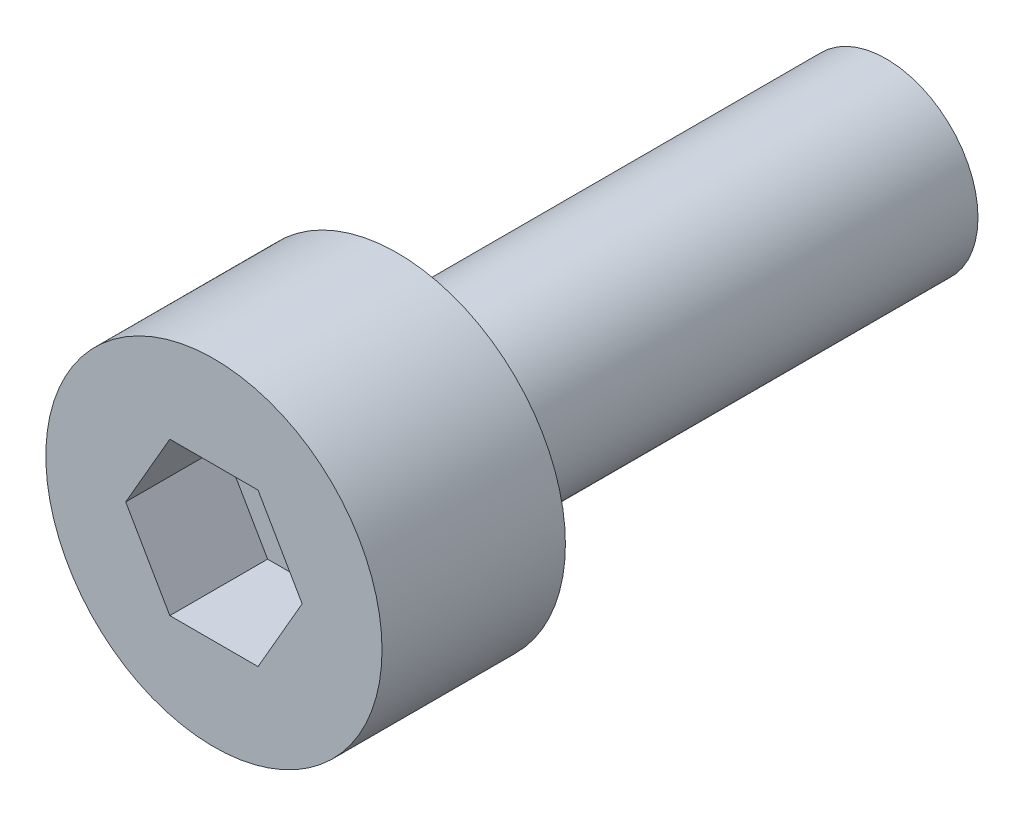
ISO-10303-21;
HEADER;
FILE_DESCRIPTION(('STEP AP214'),'2;1');
FILE_NAME('part.step','',(''),(''),'','','');
FILE_SCHEMA(('AUTOMOTIVE_DESIGN { 1 0 10303 214 1 1 1 1 }'));
ENDSEC;
DATA;
#1=APPLICATION_CONTEXT('core data for automotive mechanical design processes');
#2=APPLICATION_PROTOCOL_DEFINITION('international standard','automotive_design',2000,#1);
#3=PRODUCT_CONTEXT('',#1,'mechanical');
#4=PRODUCT('Part','Part','',(#3));
#5=PRODUCT_RELATED_PRODUCT_CATEGORY('part','',(#4));
#6=PRODUCT_DEFINITION_FORMATION('','',#4);
#7=PRODUCT_DEFINITION_CONTEXT('part definition',#1,'design');
#8=PRODUCT_DEFINITION('design','',#6,#7);
#9=PRODUCT_DEFINITION_SHAPE('','',#8);
#10=(LENGTH_UNIT() NAMED_UNIT(*) SI_UNIT(.MILLI.,.METRE.));
#11=(NAMED_UNIT(*) PLANE_ANGLE_UNIT() SI_UNIT($,.RADIAN.));
#12=(NAMED_UNIT(*) SI_UNIT($,.STERADIAN.) SOLID_ANGLE_UNIT());
#13=UNCERTAINTY_MEASURE_WITH_UNIT(LENGTH_MEASURE(1.E-05),#10,'distance_accuracy_value','');
#14=(GEOMETRIC_REPRESENTATION_CONTEXT(3) GLOBAL_UNCERTAINTY_ASSIGNED_CONTEXT((#13)) GLOBAL_UNIT_ASSIGNED_CONTEXT((#10,
#11,#12)) REPRESENTATION_CONTEXT('',''));
#15=CARTESIAN_POINT('',(0.,0.,0.));
#16=DIRECTION('',(0.,0.,1.));
#17=DIRECTION('',(1.,0.,0.));
#18=AXIS2_PLACEMENT_3D('',#15,#16,#17);
#19=CARTESIAN_POINT('',(0.,0.,11.));
#20=DIRECTION('',(0.,0.,1.));
#21=DIRECTION('',(1.,0.,0.));
#22=AXIS2_PLACEMENT_3D('',#19,#20,#21);
#23=PLANE('',#22);
#24=CARTESIAN_POINT('',(0.,0.,11.));
#25=DIRECTION('',(0.,0.,1.));
#26=DIRECTION('',(1.,0.,0.));
#27=AXIS2_PLACEMENT_3D('',#24,#25,#26);
#28=CIRCLE('',#27,2.75);
#29=CARTESIAN_POINT('',(2.75,0.,11.));
#30=VERTEX_POINT('',#29);
#31=EDGE_CURVE('E148',#30,#30,#28,.T.);
#32=ORIENTED_EDGE('',*,*,#31,.T.);
#33=EDGE_LOOP('',(#32));
#34=FACE_BOUND('',#33,.T.);
#35=DIRECTION('',(-0.5,0.866025403784439,0.));
#36=VECTOR('',#35,1.);
#37=CARTESIAN_POINT('',(1.44337567297406,0.,11.));
#38=LINE('',#37,#36);
#39=CARTESIAN_POINT('',(1.44337567297406,0.,11.));
#40=VERTEX_POINT('',#39);
#41=CARTESIAN_POINT('',(0.721687836487032,1.25,11.));
#42=VERTEX_POINT('',#41);
#43=EDGE_CURVE('E114',#40,#42,#38,.T.);
#44=ORIENTED_EDGE('',*,*,#43,.F.);
#45=DIRECTION('',(0.5,0.866025403784438,0.));
#46=VECTOR('',#45,1.);
#47=CARTESIAN_POINT('',(0.721687836487031,-1.25,11.));
#48=LINE('',#47,#46);
#49=CARTESIAN_POINT('',(0.721687836487031,-1.25,11.));
#50=VERTEX_POINT('',#49);
#51=EDGE_CURVE('E93',#50,#40,#48,.T.);
#52=ORIENTED_EDGE('',*,*,#51,.F.);
#53=DIRECTION('',(1.,0.,0.));
#54=VECTOR('',#53,1.);
#55=CARTESIAN_POINT('',(-0.721687836487033,-1.25,11.));
#56=LINE('',#55,#54);
#57=CARTESIAN_POINT('',(-0.721687836487033,-1.25,11.));
#58=VERTEX_POINT('',#57);
#59=EDGE_CURVE('E60',#58,#50,#56,.T.);
#60=ORIENTED_EDGE('',*,*,#59,.F.);
#61=DIRECTION('',(0.5,-0.866025403784439,0.));
#62=VECTOR('',#61,1.);
#63=CARTESIAN_POINT('',(-1.44337567297406,0.,11.));
#64=LINE('',#63,#62);
#65=CARTESIAN_POINT('',(-1.44337567297406,0.,11.));
#66=VERTEX_POINT('',#65);
#67=EDGE_CURVE('E124',#66,#58,#64,.T.);
#68=ORIENTED_EDGE('',*,*,#67,.F.);
#69=DIRECTION('',(-0.5,-0.866025403784439,0.));
#70=VECTOR('',#69,1.);
#71=CARTESIAN_POINT('',(-0.721687836487032,1.25,11.));
#72=LINE('',#71,#70);
#73=CARTESIAN_POINT('',(-0.721687836487032,1.25,11.));
#74=VERTEX_POINT('',#73);
#75=EDGE_CURVE('E113',#74,#66,#72,.T.);
#76=ORIENTED_EDGE('',*,*,#75,.F.);
#77=DIRECTION('',(-1.,0.,0.));
#78=VECTOR('',#77,1.);
#79=CARTESIAN_POINT('',(0.721687836487032,1.25,11.));
#80=LINE('',#79,#78);
#81=EDGE_CURVE('E102',#42,#74,#80,.T.);
#82=ORIENTED_EDGE('',*,*,#81,.F.);
#83=EDGE_LOOP('',(#44,#52,#60,#68,#76,#82));
#84=FACE_BOUND('',#83,.T.);
#85=ADVANCED_FACE('F39',(#34,#84),#23,.T.);
#86=CARTESIAN_POINT('',(0.,0.,8.));
#87=DIRECTION('',(0.,0.,-1.));
#88=DIRECTION('',(-1.,0.,0.));
#89=AXIS2_PLACEMENT_3D('',#86,#87,#88);
#90=CYLINDRICAL_SURFACE('',#89,1.5);
#91=CARTESIAN_POINT('',(0.,0.,8.));
#92=DIRECTION('',(0.,0.,1.));
#93=DIRECTION('',(1.,0.,0.));
#94=AXIS2_PLACEMENT_3D('',#91,#92,#93);
#95=CIRCLE('',#94,1.5);
#96=CARTESIAN_POINT('',(1.5,0.,8.));
#97=VERTEX_POINT('',#96);
#98=EDGE_CURVE('E11',#97,#97,#95,.T.);
#99=ORIENTED_EDGE('',*,*,#98,.F.);
#100=EDGE_LOOP('',(#99));
#101=FACE_BOUND('',#100,.T.);
#102=CARTESIAN_POINT('',(0.,0.,0.));
#103=DIRECTION('',(0.,0.,1.));
#104=DIRECTION('',(1.,0.,0.));
#105=AXIS2_PLACEMENT_3D('',#102,#103,#104);
#106=CIRCLE('',#105,1.5);
#107=CARTESIAN_POINT('',(1.5,0.,0.));
#108=VERTEX_POINT('',#107);
#109=EDGE_CURVE('E43',#108,#108,#106,.T.);
#110=ORIENTED_EDGE('',*,*,#109,.T.);
#111=EDGE_LOOP('',(#110));
#112=FACE_BOUND('',#111,.T.);
#113=ADVANCED_FACE('F41',(#101,#112),#90,.T.);
#114=CARTESIAN_POINT('',(0.,0.,0.));
#115=DIRECTION('',(0.,0.,1.));
#116=DIRECTION('',(1.,0.,0.));
#117=AXIS2_PLACEMENT_3D('',#114,#115,#116);
#118=PLANE('',#117);
#119=ORIENTED_EDGE('',*,*,#109,.F.);
#120=EDGE_LOOP('',(#119));
#121=FACE_BOUND('',#120,.T.);
#122=ADVANCED_FACE('F168',(#121),#118,.F.);
#123=CARTESIAN_POINT('',(0.,0.,11.));
#124=DIRECTION('',(0.,0.,-1.));
#125=DIRECTION('',(-1.,0.,0.));
#126=AXIS2_PLACEMENT_3D('',#123,#124,#125);
#127=CYLINDRICAL_SURFACE('',#126,2.75);
#128=ORIENTED_EDGE('',*,*,#31,.F.);
#129=EDGE_LOOP('',(#128));
#130=FACE_BOUND('',#129,.T.);
#131=CARTESIAN_POINT('',(0.,0.,8.));
#132=DIRECTION('',(0.,0.,1.));
#133=DIRECTION('',(1.,0.,0.));
#134=AXIS2_PLACEMENT_3D('',#131,#132,#133);
#135=CIRCLE('',#134,2.75);
#136=CARTESIAN_POINT('',(2.75,0.,8.));
#137=VERTEX_POINT('',#136);
#138=EDGE_CURVE('E147',#137,#137,#135,.T.);
#139=ORIENTED_EDGE('',*,*,#138,.T.);
#140=EDGE_LOOP('',(#139));
#141=FACE_BOUND('',#140,.T.);
#142=ADVANCED_FACE('F154',(#130,#141),#127,.T.);
#143=CARTESIAN_POINT('',(0.,0.,8.));
#144=DIRECTION('',(0.,0.,1.));
#145=DIRECTION('',(1.,0.,0.));
#146=AXIS2_PLACEMENT_3D('',#143,#144,#145);
#147=PLANE('',#146);
#148=ORIENTED_EDGE('',*,*,#98,.T.);
#149=EDGE_LOOP('',(#148));
#150=FACE_BOUND('',#149,.T.);
#151=ORIENTED_EDGE('',*,*,#138,.F.);
#152=EDGE_LOOP('',(#151));
#153=FACE_BOUND('',#152,.T.);
#154=ADVANCED_FACE('F156',(#150,#153),#147,.F.);
#155=CARTESIAN_POINT('',(0.721687836487031,-1.25,11.));
#156=DIRECTION('',(-0.866025403784438,0.5,0.));
#157=DIRECTION('',(-0.5,-0.866025403784439,0.));
#158=AXIS2_PLACEMENT_3D('',#155,#156,#157);
#159=PLANE('',#158);
#160=DIRECTION('',(0.5,0.866025403784438,0.));
#161=VECTOR('',#160,1.);
#162=CARTESIAN_POINT('',(0.721687836487031,-1.25,9.4));
#163=LINE('',#162,#161);
#164=CARTESIAN_POINT('',(0.721687836487031,-1.25,9.4));
#165=VERTEX_POINT('',#164);
#166=CARTESIAN_POINT('',(1.44337567297406,0.,9.4));
#167=VERTEX_POINT('',#166);
#168=EDGE_CURVE('E131',#165,#167,#163,.T.);
#169=ORIENTED_EDGE('',*,*,#168,.F.);
#170=DIRECTION('',(0.,0.,-1.));
#171=VECTOR('',#170,1.);
#172=CARTESIAN_POINT('',(0.721687836487031,-1.25,11.));
#173=LINE('',#172,#171);
#174=EDGE_CURVE('E130',#50,#165,#173,.T.);
#175=ORIENTED_EDGE('',*,*,#174,.F.);
#176=ORIENTED_EDGE('',*,*,#51,.T.);
#177=DIRECTION('',(0.,0.,-1.));
#178=VECTOR('',#177,1.);
#179=CARTESIAN_POINT('',(1.44337567297406,0.,11.));
#180=LINE('',#179,#178);
#181=EDGE_CURVE('E145',#40,#167,#180,.T.);
#182=ORIENTED_EDGE('',*,*,#181,.T.);
#183=EDGE_LOOP('',(#169,#175,#176,#182));
#184=FACE_BOUND('',#183,.T.);
#185=ADVANCED_FACE('F158',(#184),#159,.T.);
#186=CARTESIAN_POINT('',(1.44337567297406,0.,11.));
#187=DIRECTION('',(-0.866025403784439,-0.5,0.));
#188=DIRECTION('',(0.5,-0.866025403784439,0.));
#189=AXIS2_PLACEMENT_3D('',#186,#187,#188);
#190=PLANE('',#189);
#191=DIRECTION('',(-0.5,0.866025403784439,0.));
#192=VECTOR('',#191,1.);
#193=CARTESIAN_POINT('',(1.44337567297406,0.,9.4));
#194=LINE('',#193,#192);
#195=CARTESIAN_POINT('',(0.721687836487032,1.25,9.4));
#196=VERTEX_POINT('',#195);
#197=EDGE_CURVE('E133',#167,#196,#194,.T.);
#198=ORIENTED_EDGE('',*,*,#197,.F.);
#199=ORIENTED_EDGE('',*,*,#181,.F.);
#200=ORIENTED_EDGE('',*,*,#43,.T.);
#201=DIRECTION('',(0.,0.,-1.));
#202=VECTOR('',#201,1.);
#203=CARTESIAN_POINT('',(0.721687836487032,1.25,11.));
#204=LINE('',#203,#202);
#205=EDGE_CURVE('E109',#42,#196,#204,.T.);
#206=ORIENTED_EDGE('',*,*,#205,.T.);
#207=EDGE_LOOP('',(#198,#199,#200,#206));
#208=FACE_BOUND('',#207,.T.);
#209=ADVANCED_FACE('F166',(#208),#190,.T.);
#210=CARTESIAN_POINT('',(0.721687836487032,1.25,11.));
#211=DIRECTION('',(0.,-1.,0.));
#212=DIRECTION('',(1.,0.,0.));
#213=AXIS2_PLACEMENT_3D('',#210,#211,#212);
#214=PLANE('',#213);
#215=DIRECTION('',(-1.,0.,0.));
#216=VECTOR('',#215,1.);
#217=CARTESIAN_POINT('',(0.721687836487032,1.25,9.4));
#218=LINE('',#217,#216);
#219=CARTESIAN_POINT('',(-0.721687836487032,1.25,9.4));
#220=VERTEX_POINT('',#219);
#221=EDGE_CURVE('E135',#196,#220,#218,.T.);
#222=ORIENTED_EDGE('',*,*,#221,.F.);
#223=ORIENTED_EDGE('',*,*,#205,.F.);
#224=ORIENTED_EDGE('',*,*,#81,.T.);
#225=DIRECTION('',(0.,0.,-1.));
#226=VECTOR('',#225,1.);
#227=CARTESIAN_POINT('',(-0.721687836487032,1.25,11.));
#228=LINE('',#227,#226);
#229=EDGE_CURVE('E106',#74,#220,#228,.T.);
#230=ORIENTED_EDGE('',*,*,#229,.T.);
#231=EDGE_LOOP('',(#222,#223,#224,#230));
#232=FACE_BOUND('',#231,.T.);
#233=ADVANCED_FACE('F105',(#232),#214,.T.);
#234=CARTESIAN_POINT('',(-0.721687836487032,1.25,11.));
#235=DIRECTION('',(0.866025403784439,-0.5,0.));
#236=DIRECTION('',(0.5,0.866025403784439,0.));
#237=AXIS2_PLACEMENT_3D('',#234,#235,#236);
#238=PLANE('',#237);
#239=DIRECTION('',(-0.5,-0.866025403784439,0.));
#240=VECTOR('',#239,1.);
#241=CARTESIAN_POINT('',(-0.721687836487032,1.25,9.4));
#242=LINE('',#241,#240);
#243=CARTESIAN_POINT('',(-1.44337567297406,0.,9.4));
#244=VERTEX_POINT('',#243);
#245=EDGE_CURVE('E120',#220,#244,#242,.T.);
#246=ORIENTED_EDGE('',*,*,#245,.F.);
#247=ORIENTED_EDGE('',*,*,#229,.F.);
#248=ORIENTED_EDGE('',*,*,#75,.T.);
#249=DIRECTION('',(0.,0.,-1.));
#250=VECTOR('',#249,1.);
#251=CARTESIAN_POINT('',(-1.44337567297406,0.,11.));
#252=LINE('',#251,#250);
#253=EDGE_CURVE('E121',#66,#244,#252,.T.);
#254=ORIENTED_EDGE('',*,*,#253,.T.);
#255=EDGE_LOOP('',(#246,#247,#248,#254));
#256=FACE_BOUND('',#255,.T.);
#257=ADVANCED_FACE('F117',(#256),#238,.T.);
#258=CARTESIAN_POINT('',(-1.44337567297406,0.,11.));
#259=DIRECTION('',(0.866025403784439,0.5,0.));
#260=DIRECTION('',(-0.5,0.866025403784439,0.));
#261=AXIS2_PLACEMENT_3D('',#258,#259,#260);
#262=PLANE('',#261);
#263=DIRECTION('',(0.5,-0.866025403784439,0.));
#264=VECTOR('',#263,1.);
#265=CARTESIAN_POINT('',(-1.44337567297406,0.,9.4));
#266=LINE('',#265,#264);
#267=CARTESIAN_POINT('',(-0.721687836487033,-1.25,9.4));
#268=VERTEX_POINT('',#267);
#269=EDGE_CURVE('E138',#244,#268,#266,.T.);
#270=ORIENTED_EDGE('',*,*,#269,.F.);
#271=ORIENTED_EDGE('',*,*,#253,.F.);
#272=ORIENTED_EDGE('',*,*,#67,.T.);
#273=DIRECTION('',(0.,0.,-1.));
#274=VECTOR('',#273,1.);
#275=CARTESIAN_POINT('',(-0.721687836487033,-1.25,11.));
#276=LINE('',#275,#274);
#277=EDGE_CURVE('E54',#58,#268,#276,.T.);
#278=ORIENTED_EDGE('',*,*,#277,.T.);
#279=EDGE_LOOP('',(#270,#271,#272,#278));
#280=FACE_BOUND('',#279,.T.);
#281=ADVANCED_FACE('F185',(#280),#262,.T.);
#282=CARTESIAN_POINT('',(-0.721687836487033,-1.25,11.));
#283=DIRECTION('',(0.,1.,0.));
#284=DIRECTION('',(-1.,0.,0.));
#285=AXIS2_PLACEMENT_3D('',#282,#283,#284);
#286=PLANE('',#285);
#287=DIRECTION('',(1.,0.,0.));
#288=VECTOR('',#287,1.);
#289=CARTESIAN_POINT('',(-0.721687836487033,-1.25,9.4));
#290=LINE('',#289,#288);
#291=EDGE_CURVE('E86',#268,#165,#290,.T.);
#292=ORIENTED_EDGE('',*,*,#291,.F.);
#293=ORIENTED_EDGE('',*,*,#277,.F.);
#294=ORIENTED_EDGE('',*,*,#59,.T.);
#295=ORIENTED_EDGE('',*,*,#174,.T.);
#296=EDGE_LOOP('',(#292,#293,#294,#295));
#297=FACE_BOUND('',#296,.T.);
#298=ADVANCED_FACE('F188',(#297),#286,.T.);
#299=CARTESIAN_POINT('',(0.,0.,9.4));
#300=DIRECTION('',(0.,0.,1.));
#301=DIRECTION('',(1.,0.,0.));
#302=AXIS2_PLACEMENT_3D('',#299,#300,#301);
#303=PLANE('',#302);
#304=ORIENTED_EDGE('',*,*,#168,.T.);
#305=ORIENTED_EDGE('',*,*,#197,.T.);
#306=ORIENTED_EDGE('',*,*,#221,.T.);
#307=ORIENTED_EDGE('',*,*,#245,.T.);
#308=ORIENTED_EDGE('',*,*,#269,.T.);
#309=ORIENTED_EDGE('',*,*,#291,.T.);
#310=EDGE_LOOP('',(#304,#305,#306,#307,#308,#309));
#311=FACE_BOUND('',#310,.T.);
#312=ADVANCED_FACE('F192',(#311),#303,.T.);
#313=CLOSED_SHELL('',(#85,#113,#122,#142,#154,#185,#209,#233,#257,#281,#298,#312));
#314=MANIFOLD_SOLID_BREP('B2',#313);
#315=ADVANCED_BREP_SHAPE_REPRESENTATION('',(#18,#314),#14);
#316=SHAPE_DEFINITION_REPRESENTATION(#9,#315);
ENDSEC;
END-ISO-10303-21;
